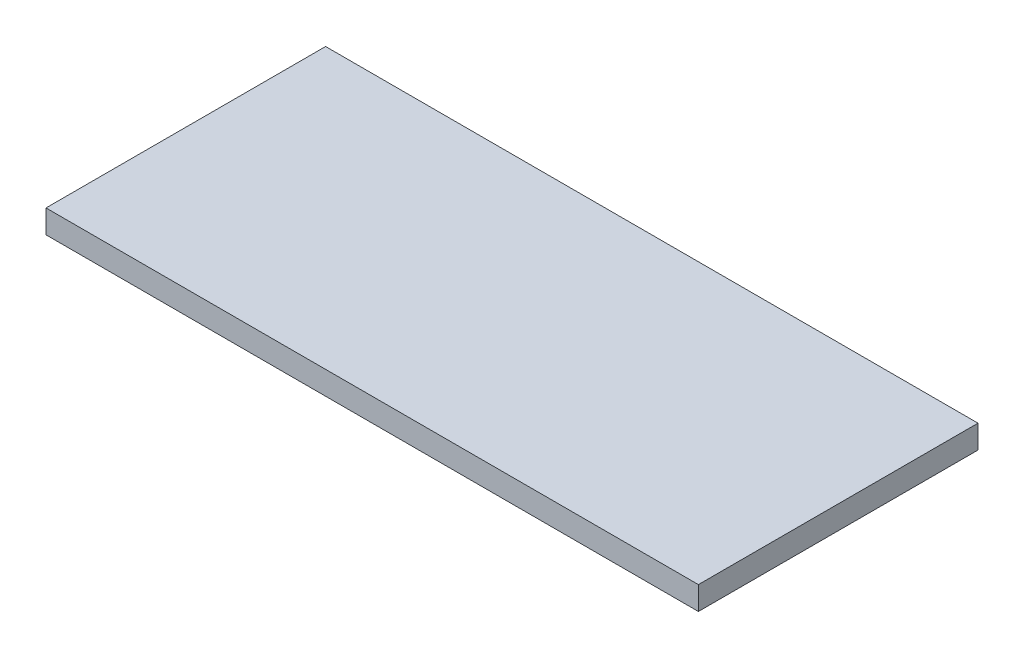
ISO-10303-21;
HEADER;
FILE_DESCRIPTION(('STEP AP214'),'2;1');
FILE_NAME('part.step','',(''),(''),'','','');
FILE_SCHEMA(('AUTOMOTIVE_DESIGN { 1 0 10303 214 1 1 1 1 }'));
ENDSEC;
DATA;
#1=APPLICATION_CONTEXT('core data for automotive mechanical design processes');
#2=APPLICATION_PROTOCOL_DEFINITION('international standard','automotive_design',2000,#1);
#3=PRODUCT_CONTEXT('',#1,'mechanical');
#4=PRODUCT('Part','Part','',(#3));
#5=PRODUCT_RELATED_PRODUCT_CATEGORY('part','',(#4));
#6=PRODUCT_DEFINITION_FORMATION('','',#4);
#7=PRODUCT_DEFINITION_CONTEXT('part definition',#1,'design');
#8=PRODUCT_DEFINITION('design','',#6,#7);
#9=PRODUCT_DEFINITION_SHAPE('','',#8);
#10=(LENGTH_UNIT() NAMED_UNIT(*) SI_UNIT(.MILLI.,.METRE.));
#11=(NAMED_UNIT(*) PLANE_ANGLE_UNIT() SI_UNIT($,.RADIAN.));
#12=(NAMED_UNIT(*) SI_UNIT($,.STERADIAN.) SOLID_ANGLE_UNIT());
#13=UNCERTAINTY_MEASURE_WITH_UNIT(LENGTH_MEASURE(1.E-05),#10,'distance_accuracy_value','');
#14=(GEOMETRIC_REPRESENTATION_CONTEXT(3) GLOBAL_UNCERTAINTY_ASSIGNED_CONTEXT((#13)) GLOBAL_UNIT_ASSIGNED_CONTEXT((#10,
#11,#12)) REPRESENTATION_CONTEXT('',''));
#15=CARTESIAN_POINT('',(0.,0.,0.));
#16=DIRECTION('',(0.,0.,1.));
#17=DIRECTION('',(1.,0.,0.));
#18=AXIS2_PLACEMENT_3D('',#15,#16,#17);
#19=CARTESIAN_POINT('',(44.45,3.175,-19.05));
#20=DIRECTION('',(-1.,0.,0.));
#21=DIRECTION('',(0.,0.,1.));
#22=AXIS2_PLACEMENT_3D('',#19,#20,#21);
#23=PLANE('',#22);
#24=DIRECTION('',(0.,0.,-1.));
#25=VECTOR('',#24,1.);
#26=CARTESIAN_POINT('',(44.45,0.,-19.05));
#27=LINE('',#26,#25);
#28=CARTESIAN_POINT('',(44.45,0.,19.05));
#29=VERTEX_POINT('',#28);
#30=CARTESIAN_POINT('',(44.45,0.,-19.05));
#31=VERTEX_POINT('',#30);
#32=EDGE_CURVE('E102',#29,#31,#27,.T.);
#33=ORIENTED_EDGE('',*,*,#32,.T.);
#34=DIRECTION('',(0.,-1.,0.));
#35=VECTOR('',#34,1.);
#36=CARTESIAN_POINT('',(44.45,3.175,-19.05));
#37=LINE('',#36,#35);
#38=CARTESIAN_POINT('',(44.45,3.175,-19.05));
#39=VERTEX_POINT('',#38);
#40=EDGE_CURVE('E11',#39,#31,#37,.T.);
#41=ORIENTED_EDGE('',*,*,#40,.F.);
#42=DIRECTION('',(0.,0.,-1.));
#43=VECTOR('',#42,1.);
#44=CARTESIAN_POINT('',(44.45,3.175,-19.05));
#45=LINE('',#44,#43);
#46=CARTESIAN_POINT('',(44.45,3.175,19.05));
#47=VERTEX_POINT('',#46);
#48=EDGE_CURVE('E90',#47,#39,#45,.T.);
#49=ORIENTED_EDGE('',*,*,#48,.F.);
#50=DIRECTION('',(0.,-1.,0.));
#51=VECTOR('',#50,1.);
#52=CARTESIAN_POINT('',(44.45,3.175,19.05));
#53=LINE('',#52,#51);
#54=EDGE_CURVE('E98',#47,#29,#53,.T.);
#55=ORIENTED_EDGE('',*,*,#54,.T.);
#56=EDGE_LOOP('',(#33,#41,#49,#55));
#57=FACE_BOUND('',#56,.T.);
#58=ADVANCED_FACE('F39',(#57),#23,.F.);
#59=CARTESIAN_POINT('',(-44.45,3.175,-19.05));
#60=DIRECTION('',(0.,0.,1.));
#61=DIRECTION('',(1.,0.,0.));
#62=AXIS2_PLACEMENT_3D('',#59,#60,#61);
#63=PLANE('',#62);
#64=DIRECTION('',(-1.,0.,0.));
#65=VECTOR('',#64,1.);
#66=CARTESIAN_POINT('',(-44.45,0.,-19.05));
#67=LINE('',#66,#65);
#68=CARTESIAN_POINT('',(-44.45,0.,-19.05));
#69=VERTEX_POINT('',#68);
#70=EDGE_CURVE('E94',#31,#69,#67,.T.);
#71=ORIENTED_EDGE('',*,*,#70,.T.);
#72=DIRECTION('',(0.,-1.,0.));
#73=VECTOR('',#72,1.);
#74=CARTESIAN_POINT('',(-44.45,3.175,-19.05));
#75=LINE('',#74,#73);
#76=CARTESIAN_POINT('',(-44.45,3.175,-19.05));
#77=VERTEX_POINT('',#76);
#78=EDGE_CURVE('E47',#77,#69,#75,.T.);
#79=ORIENTED_EDGE('',*,*,#78,.F.);
#80=DIRECTION('',(-1.,0.,0.));
#81=VECTOR('',#80,1.);
#82=CARTESIAN_POINT('',(-44.45,3.175,-19.05));
#83=LINE('',#82,#81);
#84=EDGE_CURVE('E85',#39,#77,#83,.T.);
#85=ORIENTED_EDGE('',*,*,#84,.F.);
#86=ORIENTED_EDGE('',*,*,#40,.T.);
#87=EDGE_LOOP('',(#71,#79,#85,#86));
#88=FACE_BOUND('',#87,.T.);
#89=ADVANCED_FACE('F93',(#88),#63,.F.);
#90=CARTESIAN_POINT('',(-44.45,3.175,-19.05));
#91=DIRECTION('',(1.,0.,0.));
#92=DIRECTION('',(0.,0.,-1.));
#93=AXIS2_PLACEMENT_3D('',#90,#91,#92);
#94=PLANE('',#93);
#95=DIRECTION('',(0.,0.,1.));
#96=VECTOR('',#95,1.);
#97=CARTESIAN_POINT('',(-44.45,0.,-19.05));
#98=LINE('',#97,#96);
#99=CARTESIAN_POINT('',(-44.45,0.,19.05));
#100=VERTEX_POINT('',#99);
#101=EDGE_CURVE('E72',#69,#100,#98,.T.);
#102=ORIENTED_EDGE('',*,*,#101,.T.);
#103=DIRECTION('',(0.,-1.,0.));
#104=VECTOR('',#103,1.);
#105=CARTESIAN_POINT('',(-44.45,3.175,19.05));
#106=LINE('',#105,#104);
#107=CARTESIAN_POINT('',(-44.45,3.175,19.05));
#108=VERTEX_POINT('',#107);
#109=EDGE_CURVE('E95',#108,#100,#106,.T.);
#110=ORIENTED_EDGE('',*,*,#109,.F.);
#111=DIRECTION('',(0.,0.,1.));
#112=VECTOR('',#111,1.);
#113=CARTESIAN_POINT('',(-44.45,3.175,-19.05));
#114=LINE('',#113,#112);
#115=EDGE_CURVE('E88',#77,#108,#114,.T.);
#116=ORIENTED_EDGE('',*,*,#115,.F.);
#117=ORIENTED_EDGE('',*,*,#78,.T.);
#118=EDGE_LOOP('',(#102,#110,#116,#117));
#119=FACE_BOUND('',#118,.T.);
#120=ADVANCED_FACE('F96',(#119),#94,.F.);
#121=CARTESIAN_POINT('',(-44.45,3.175,19.05));
#122=DIRECTION('',(0.,0.,-1.));
#123=DIRECTION('',(-1.,0.,0.));
#124=AXIS2_PLACEMENT_3D('',#121,#122,#123);
#125=PLANE('',#124);
#126=DIRECTION('',(1.,0.,0.));
#127=VECTOR('',#126,1.);
#128=CARTESIAN_POINT('',(-44.45,0.,19.05));
#129=LINE('',#128,#127);
#130=EDGE_CURVE('E78',#100,#29,#129,.T.);
#131=ORIENTED_EDGE('',*,*,#130,.T.);
#132=ORIENTED_EDGE('',*,*,#54,.F.);
#133=DIRECTION('',(1.,0.,0.));
#134=VECTOR('',#133,1.);
#135=CARTESIAN_POINT('',(-44.45,3.175,19.05));
#136=LINE('',#135,#134);
#137=EDGE_CURVE('E55',#108,#47,#136,.T.);
#138=ORIENTED_EDGE('',*,*,#137,.F.);
#139=ORIENTED_EDGE('',*,*,#109,.T.);
#140=EDGE_LOOP('',(#131,#132,#138,#139));
#141=FACE_BOUND('',#140,.T.);
#142=ADVANCED_FACE('F109',(#141),#125,.F.);
#143=CARTESIAN_POINT('',(0.,3.175,0.));
#144=DIRECTION('',(0.,1.,0.));
#145=DIRECTION('',(0.,0.,1.));
#146=AXIS2_PLACEMENT_3D('',#143,#144,#145);
#147=PLANE('',#146);
#148=ORIENTED_EDGE('',*,*,#48,.T.);
#149=ORIENTED_EDGE('',*,*,#84,.T.);
#150=ORIENTED_EDGE('',*,*,#115,.T.);
#151=ORIENTED_EDGE('',*,*,#137,.T.);
#152=EDGE_LOOP('',(#148,#149,#150,#151));
#153=FACE_BOUND('',#152,.T.);
#154=ADVANCED_FACE('F86',(#153),#147,.T.);
#155=CARTESIAN_POINT('',(0.,0.,0.));
#156=DIRECTION('',(0.,1.,0.));
#157=DIRECTION('',(0.,0.,1.));
#158=AXIS2_PLACEMENT_3D('',#155,#156,#157);
#159=PLANE('',#158);
#160=ORIENTED_EDGE('',*,*,#32,.F.);
#161=ORIENTED_EDGE('',*,*,#130,.F.);
#162=ORIENTED_EDGE('',*,*,#101,.F.);
#163=ORIENTED_EDGE('',*,*,#70,.F.);
#164=EDGE_LOOP('',(#160,#161,#162,#163));
#165=FACE_BOUND('',#164,.T.);
#166=ADVANCED_FACE('F112',(#165),#159,.F.);
#167=CLOSED_SHELL('',(#58,#89,#120,#142,#154,#166));
#168=MANIFOLD_SOLID_BREP('B2',#167);
#169=ADVANCED_BREP_SHAPE_REPRESENTATION('',(#18,#168),#14);
#170=SHAPE_DEFINITION_REPRESENTATION(#9,#169);
ENDSEC;
END-ISO-10303-21;
